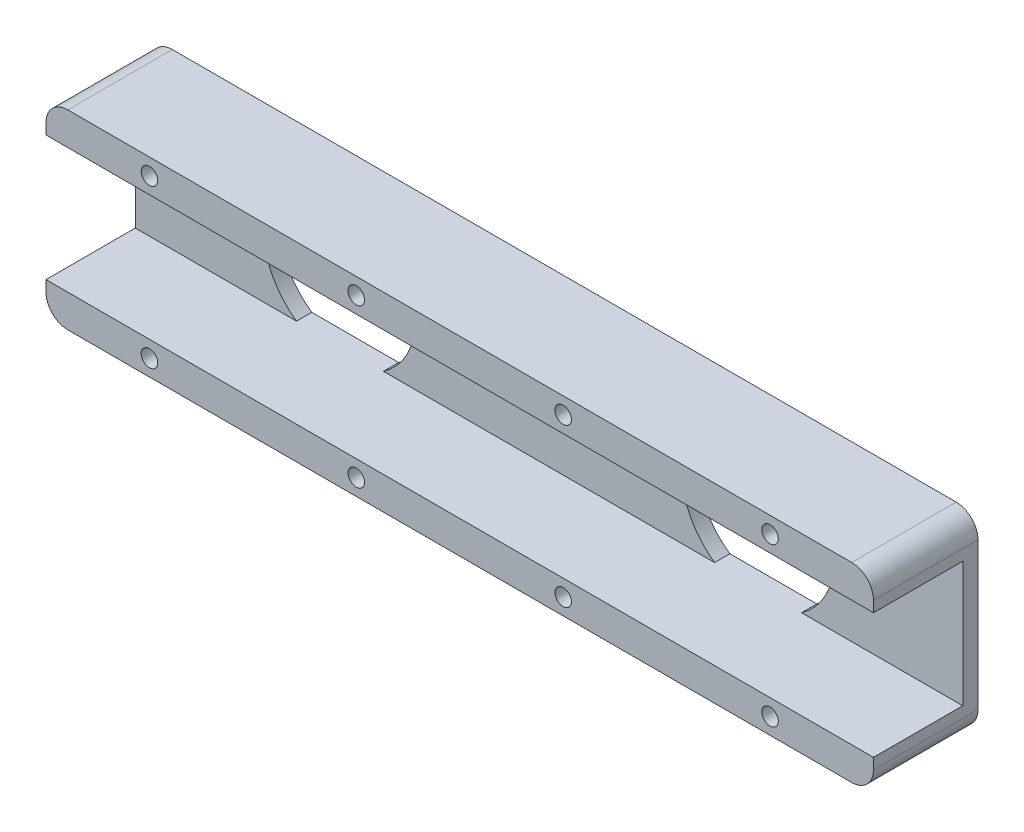
ISO-10303-21;
HEADER;
FILE_DESCRIPTION(('STEP AP214'),'2;1');
FILE_NAME('part.step','',(''),(''),'','','');
FILE_SCHEMA(('AUTOMOTIVE_DESIGN { 1 0 10303 214 1 1 1 1 }'));
ENDSEC;
DATA;
#1=APPLICATION_CONTEXT('core data for automotive mechanical design processes');
#2=APPLICATION_PROTOCOL_DEFINITION('international standard','automotive_design',2000,#1);
#3=PRODUCT_CONTEXT('',#1,'mechanical');
#4=PRODUCT('Part','Part','',(#3));
#5=PRODUCT_RELATED_PRODUCT_CATEGORY('part','',(#4));
#6=PRODUCT_DEFINITION_FORMATION('','',#4);
#7=PRODUCT_DEFINITION_CONTEXT('part definition',#1,'design');
#8=PRODUCT_DEFINITION('design','',#6,#7);
#9=PRODUCT_DEFINITION_SHAPE('','',#8);
#10=(LENGTH_UNIT() NAMED_UNIT(*) SI_UNIT(.MILLI.,.METRE.));
#11=(NAMED_UNIT(*) PLANE_ANGLE_UNIT() SI_UNIT($,.RADIAN.));
#12=(NAMED_UNIT(*) SI_UNIT($,.STERADIAN.) SOLID_ANGLE_UNIT());
#13=UNCERTAINTY_MEASURE_WITH_UNIT(LENGTH_MEASURE(1.E-05),#10,'distance_accuracy_value','');
#14=(GEOMETRIC_REPRESENTATION_CONTEXT(3) GLOBAL_UNCERTAINTY_ASSIGNED_CONTEXT((#13)) GLOBAL_UNIT_ASSIGNED_CONTEXT((#10,
#11,#12)) REPRESENTATION_CONTEXT('',''));
#15=CARTESIAN_POINT('',(0.,0.,0.));
#16=DIRECTION('',(0.,0.,1.));
#17=DIRECTION('',(1.,0.,0.));
#18=AXIS2_PLACEMENT_3D('',#15,#16,#17);
#19=CARTESIAN_POINT('',(0.,0.,3.5));
#20=DIRECTION('',(0.,0.,-1.));
#21=DIRECTION('',(-1.,0.,0.));
#22=AXIS2_PLACEMENT_3D('',#19,#20,#21);
#23=PLANE('',#22);
#24=DIRECTION('',(-1.,0.,0.));
#25=VECTOR('',#24,1.);
#26=CARTESIAN_POINT('',(95.,-14.375,3.5));
#27=LINE('',#26,#25);
#28=CARTESIAN_POINT('',(95.,-14.375,3.5));
#29=VERTEX_POINT('',#28);
#30=CARTESIAN_POINT('',(57.9804496391696,-14.375,3.5));
#31=VERTEX_POINT('',#30);
#32=EDGE_CURVE('E182',#29,#31,#27,.T.);
#33=ORIENTED_EDGE('',*,*,#32,.F.);
#34=DIRECTION('',(0.,1.,0.));
#35=VECTOR('',#34,1.);
#36=CARTESIAN_POINT('',(95.,-21.875,3.5));
#37=LINE('',#36,#35);
#38=CARTESIAN_POINT('',(95.,14.375,3.5));
#39=VERTEX_POINT('',#38);
#40=EDGE_CURVE('E196',#29,#39,#37,.T.);
#41=ORIENTED_EDGE('',*,*,#40,.T.);
#42=DIRECTION('',(1.,0.,0.));
#43=VECTOR('',#42,1.);
#44=CARTESIAN_POINT('',(95.,14.375,3.5));
#45=LINE('',#44,#43);
#46=CARTESIAN_POINT('',(57.9804496391696,14.375,3.5));
#47=VERTEX_POINT('',#46);
#48=EDGE_CURVE('E203',#47,#39,#45,.T.);
#49=ORIENTED_EDGE('',*,*,#48,.F.);
#50=CARTESIAN_POINT('',(48.,0.,3.5));
#51=DIRECTION('',(0.,0.,1.));
#52=DIRECTION('',(-1.,0.,0.));
#53=AXIS2_PLACEMENT_3D('',#50,#51,#52);
#54=CIRCLE('',#53,17.5);
#55=EDGE_CURVE('E254',#31,#47,#54,.T.);
#56=ORIENTED_EDGE('',*,*,#55,.F.);
#57=EDGE_LOOP('',(#33,#41,#49,#56));
#58=FACE_BOUND('',#57,.T.);
#59=ADVANCED_FACE('F33',(#58),#23,.F.);
#60=CARTESIAN_POINT('',(38.0195503608304,-14.375,3.5));
#61=VERTEX_POINT('',#60);
#62=CARTESIAN_POINT('',(-38.0195503608304,-14.375,3.5));
#63=VERTEX_POINT('',#62);
#64=EDGE_CURVE('E338',#61,#63,#27,.T.);
#65=ORIENTED_EDGE('',*,*,#64,.F.);
#66=CARTESIAN_POINT('',(48.,0.,3.5));
#67=DIRECTION('',(0.,0.,1.));
#68=DIRECTION('',(1.,0.,0.));
#69=AXIS2_PLACEMENT_3D('',#66,#67,#68);
#70=CIRCLE('',#69,17.5);
#71=CARTESIAN_POINT('',(38.0195503608304,14.375,3.5));
#72=VERTEX_POINT('',#71);
#73=EDGE_CURVE('E251',#72,#61,#70,.T.);
#74=ORIENTED_EDGE('',*,*,#73,.F.);
#75=CARTESIAN_POINT('',(-38.0195503608304,14.375,3.5));
#76=VERTEX_POINT('',#75);
#77=EDGE_CURVE('E202',#76,#72,#45,.T.);
#78=ORIENTED_EDGE('',*,*,#77,.F.);
#79=CARTESIAN_POINT('',(-48.,0.,3.5));
#80=DIRECTION('',(0.,0.,1.));
#81=DIRECTION('',(-1.,0.,0.));
#82=AXIS2_PLACEMENT_3D('',#79,#80,#81);
#83=CIRCLE('',#82,17.5);
#84=EDGE_CURVE('E226',#63,#76,#83,.T.);
#85=ORIENTED_EDGE('',*,*,#84,.F.);
#86=EDGE_LOOP('',(#65,#74,#78,#85));
#87=FACE_BOUND('',#86,.T.);
#88=ADVANCED_FACE('F456',(#87),#23,.F.);
#89=CARTESIAN_POINT('',(-57.9804496391696,-14.375,3.5));
#90=VERTEX_POINT('',#89);
#91=CARTESIAN_POINT('',(-95.,-14.375,3.5));
#92=VERTEX_POINT('',#91);
#93=EDGE_CURVE('E339',#90,#92,#27,.T.);
#94=ORIENTED_EDGE('',*,*,#93,.F.);
#95=CARTESIAN_POINT('',(-48.,0.,3.5));
#96=DIRECTION('',(0.,0.,1.));
#97=DIRECTION('',(1.,0.,0.));
#98=AXIS2_PLACEMENT_3D('',#95,#96,#97);
#99=CIRCLE('',#98,17.5);
#100=CARTESIAN_POINT('',(-57.9804496391696,14.375,3.5));
#101=VERTEX_POINT('',#100);
#102=EDGE_CURVE('E223',#101,#90,#99,.T.);
#103=ORIENTED_EDGE('',*,*,#102,.F.);
#104=CARTESIAN_POINT('',(-95.,14.375,3.5));
#105=VERTEX_POINT('',#104);
#106=EDGE_CURVE('E197',#105,#101,#45,.T.);
#107=ORIENTED_EDGE('',*,*,#106,.F.);
#108=DIRECTION('',(0.,-1.,0.));
#109=VECTOR('',#108,1.);
#110=CARTESIAN_POINT('',(-95.,14.375,3.5));
#111=LINE('',#110,#109);
#112=EDGE_CURVE('E279',#105,#92,#111,.T.);
#113=ORIENTED_EDGE('',*,*,#112,.T.);
#114=EDGE_LOOP('',(#94,#103,#107,#113));
#115=FACE_BOUND('',#114,.T.);
#116=ADVANCED_FACE('F423',(#115),#23,.F.);
#117=CARTESIAN_POINT('',(0.,0.,0.));
#118=DIRECTION('',(0.,0.,-1.));
#119=DIRECTION('',(-1.,0.,0.));
#120=AXIS2_PLACEMENT_3D('',#117,#118,#119);
#121=PLANE('',#120);
#122=CARTESIAN_POINT('',(-71.25,18.125,0.));
#123=DIRECTION('',(0.,0.,-1.));
#124=DIRECTION('',(-1.,0.,0.));
#125=AXIS2_PLACEMENT_3D('',#122,#123,#124);
#126=CIRCLE('',#125,3.5433);
#127=CARTESIAN_POINT('',(-74.7933,18.125,0.));
#128=VERTEX_POINT('',#127);
#129=EDGE_CURVE('E414',#128,#128,#126,.T.);
#130=ORIENTED_EDGE('',*,*,#129,.F.);
#131=EDGE_LOOP('',(#130));
#132=FACE_BOUND('',#131,.T.);
#133=CARTESIAN_POINT('',(-23.75,18.125,0.));
#134=DIRECTION('',(0.,0.,-1.));
#135=DIRECTION('',(-1.,0.,0.));
#136=AXIS2_PLACEMENT_3D('',#133,#134,#135);
#137=CIRCLE('',#136,3.5433);
#138=CARTESIAN_POINT('',(-27.2933,18.125,0.));
#139=VERTEX_POINT('',#138);
#140=EDGE_CURVE('E405',#139,#139,#137,.T.);
#141=ORIENTED_EDGE('',*,*,#140,.F.);
#142=EDGE_LOOP('',(#141));
#143=FACE_BOUND('',#142,.T.);
#144=CARTESIAN_POINT('',(23.75,18.125,0.));
#145=DIRECTION('',(0.,0.,-1.));
#146=DIRECTION('',(-1.,0.,0.));
#147=AXIS2_PLACEMENT_3D('',#144,#145,#146);
#148=CIRCLE('',#147,3.5433);
#149=CARTESIAN_POINT('',(20.2067,18.125,0.));
#150=VERTEX_POINT('',#149);
#151=EDGE_CURVE('E396',#150,#150,#148,.T.);
#152=ORIENTED_EDGE('',*,*,#151,.F.);
#153=EDGE_LOOP('',(#152));
#154=FACE_BOUND('',#153,.T.);
#155=CARTESIAN_POINT('',(71.25,18.125,0.));
#156=DIRECTION('',(0.,0.,-1.));
#157=DIRECTION('',(-1.,0.,0.));
#158=AXIS2_PLACEMENT_3D('',#155,#156,#157);
#159=CIRCLE('',#158,3.5433);
#160=CARTESIAN_POINT('',(67.7067,18.125,0.));
#161=VERTEX_POINT('',#160);
#162=EDGE_CURVE('E387',#161,#161,#159,.T.);
#163=ORIENTED_EDGE('',*,*,#162,.F.);
#164=EDGE_LOOP('',(#163));
#165=FACE_BOUND('',#164,.T.);
#166=CARTESIAN_POINT('',(-71.25,-18.125,0.));
#167=DIRECTION('',(0.,0.,-1.));
#168=DIRECTION('',(-1.,0.,0.));
#169=AXIS2_PLACEMENT_3D('',#166,#167,#168);
#170=CIRCLE('',#169,3.5433);
#171=CARTESIAN_POINT('',(-74.7933,-18.125,0.));
#172=VERTEX_POINT('',#171);
#173=EDGE_CURVE('E378',#172,#172,#170,.T.);
#174=ORIENTED_EDGE('',*,*,#173,.F.);
#175=EDGE_LOOP('',(#174));
#176=FACE_BOUND('',#175,.T.);
#177=CARTESIAN_POINT('',(-23.75,-18.125,0.));
#178=DIRECTION('',(0.,0.,-1.));
#179=DIRECTION('',(-1.,0.,0.));
#180=AXIS2_PLACEMENT_3D('',#177,#178,#179);
#181=CIRCLE('',#180,3.5433);
#182=CARTESIAN_POINT('',(-27.2933,-18.125,0.));
#183=VERTEX_POINT('',#182);
#184=EDGE_CURVE('E369',#183,#183,#181,.T.);
#185=ORIENTED_EDGE('',*,*,#184,.F.);
#186=EDGE_LOOP('',(#185));
#187=FACE_BOUND('',#186,.T.);
#188=CARTESIAN_POINT('',(23.75,-18.125,0.));
#189=DIRECTION('',(0.,0.,-1.));
#190=DIRECTION('',(-1.,0.,0.));
#191=AXIS2_PLACEMENT_3D('',#188,#189,#190);
#192=CIRCLE('',#191,3.5433);
#193=CARTESIAN_POINT('',(20.2067,-18.125,0.));
#194=VERTEX_POINT('',#193);
#195=EDGE_CURVE('E360',#194,#194,#192,.T.);
#196=ORIENTED_EDGE('',*,*,#195,.F.);
#197=EDGE_LOOP('',(#196));
#198=FACE_BOUND('',#197,.T.);
#199=CARTESIAN_POINT('',(71.25,-18.125,0.));
#200=DIRECTION('',(0.,0.,-1.));
#201=DIRECTION('',(-1.,0.,0.));
#202=AXIS2_PLACEMENT_3D('',#199,#200,#201);
#203=CIRCLE('',#202,3.5433);
#204=CARTESIAN_POINT('',(67.7067,-18.125,0.));
#205=VERTEX_POINT('',#204);
#206=EDGE_CURVE('E349',#205,#205,#203,.T.);
#207=ORIENTED_EDGE('',*,*,#206,.F.);
#208=EDGE_LOOP('',(#207));
#209=FACE_BOUND('',#208,.T.);
#210=DIRECTION('',(-1.,0.,0.));
#211=VECTOR('',#210,1.);
#212=CARTESIAN_POINT('',(-95.,21.875,0.));
#213=LINE('',#212,#211);
#214=CARTESIAN_POINT('',(90.,21.875,0.));
#215=VERTEX_POINT('',#214);
#216=CARTESIAN_POINT('',(-90.,21.875,0.));
#217=VERTEX_POINT('',#216);
#218=EDGE_CURVE('E278',#215,#217,#213,.T.);
#219=ORIENTED_EDGE('',*,*,#218,.F.);
#220=CARTESIAN_POINT('',(90.,16.875,0.));
#221=DIRECTION('',(0.,0.,-1.));
#222=DIRECTION('',(-1.,0.,0.));
#223=AXIS2_PLACEMENT_3D('',#220,#221,#222);
#224=CIRCLE('',#223,5.);
#225=CARTESIAN_POINT('',(95.,16.875,0.));
#226=VERTEX_POINT('',#225);
#227=EDGE_CURVE('E302',#215,#226,#224,.T.);
#228=ORIENTED_EDGE('',*,*,#227,.T.);
#229=DIRECTION('',(0.,1.,0.));
#230=VECTOR('',#229,1.);
#231=CARTESIAN_POINT('',(95.,21.875,0.));
#232=LINE('',#231,#230);
#233=CARTESIAN_POINT('',(95.,-16.875,0.));
#234=VERTEX_POINT('',#233);
#235=EDGE_CURVE('E282',#234,#226,#232,.T.);
#236=ORIENTED_EDGE('',*,*,#235,.F.);
#237=CARTESIAN_POINT('',(90.,-16.875,0.));
#238=DIRECTION('',(0.,0.,-1.));
#239=DIRECTION('',(-1.,0.,0.));
#240=AXIS2_PLACEMENT_3D('',#237,#238,#239);
#241=CIRCLE('',#240,5.);
#242=CARTESIAN_POINT('',(90.,-21.875,0.));
#243=VERTEX_POINT('',#242);
#244=EDGE_CURVE('E300',#234,#243,#241,.T.);
#245=ORIENTED_EDGE('',*,*,#244,.T.);
#246=DIRECTION('',(1.,0.,0.));
#247=VECTOR('',#246,1.);
#248=CARTESIAN_POINT('',(-95.,-21.875,0.));
#249=LINE('',#248,#247);
#250=CARTESIAN_POINT('',(-90.,-21.875,0.));
#251=VERTEX_POINT('',#250);
#252=EDGE_CURVE('E288',#251,#243,#249,.T.);
#253=ORIENTED_EDGE('',*,*,#252,.F.);
#254=CARTESIAN_POINT('',(-90.,-16.875,0.));
#255=DIRECTION('',(0.,0.,-1.));
#256=DIRECTION('',(-1.,0.,0.));
#257=AXIS2_PLACEMENT_3D('',#254,#255,#256);
#258=CIRCLE('',#257,5.);
#259=CARTESIAN_POINT('',(-95.,-16.875,0.));
#260=VERTEX_POINT('',#259);
#261=EDGE_CURVE('E298',#251,#260,#258,.T.);
#262=ORIENTED_EDGE('',*,*,#261,.T.);
#263=DIRECTION('',(0.,-1.,0.));
#264=VECTOR('',#263,1.);
#265=CARTESIAN_POINT('',(-95.,-14.375,0.));
#266=LINE('',#265,#264);
#267=CARTESIAN_POINT('',(-95.,16.875,0.));
#268=VERTEX_POINT('',#267);
#269=EDGE_CURVE('E286',#268,#260,#266,.T.);
#270=ORIENTED_EDGE('',*,*,#269,.F.);
#271=CARTESIAN_POINT('',(-90.,16.875,0.));
#272=DIRECTION('',(0.,0.,-1.));
#273=DIRECTION('',(-1.,0.,0.));
#274=AXIS2_PLACEMENT_3D('',#271,#272,#273);
#275=CIRCLE('',#274,5.);
#276=EDGE_CURVE('E296',#268,#217,#275,.T.);
#277=ORIENTED_EDGE('',*,*,#276,.T.);
#278=EDGE_LOOP('',(#219,#228,#236,#245,#253,#262,#270,#277));
#279=FACE_BOUND('',#278,.T.);
#280=DIRECTION('',(-1.,0.,0.));
#281=VECTOR('',#280,1.);
#282=CARTESIAN_POINT('',(57.9804496391696,14.375,0.));
#283=LINE('',#282,#281);
#284=CARTESIAN_POINT('',(57.9804496391696,14.375,0.));
#285=VERTEX_POINT('',#284);
#286=CARTESIAN_POINT('',(38.0195503608304,14.375,0.));
#287=VERTEX_POINT('',#286);
#288=EDGE_CURVE('E255',#285,#287,#283,.T.);
#289=ORIENTED_EDGE('',*,*,#288,.T.);
#290=CARTESIAN_POINT('',(48.,0.,0.));
#291=DIRECTION('',(0.,0.,1.));
#292=DIRECTION('',(1.,0.,0.));
#293=AXIS2_PLACEMENT_3D('',#290,#291,#292);
#294=CIRCLE('',#293,17.5);
#295=CARTESIAN_POINT('',(38.0195503608304,-14.375,0.));
#296=VERTEX_POINT('',#295);
#297=EDGE_CURVE('E250',#287,#296,#294,.T.);
#298=ORIENTED_EDGE('',*,*,#297,.T.);
#299=DIRECTION('',(1.,0.,0.));
#300=VECTOR('',#299,1.);
#301=CARTESIAN_POINT('',(57.9804496391696,-14.375,0.));
#302=LINE('',#301,#300);
#303=CARTESIAN_POINT('',(57.9804496391696,-14.375,0.));
#304=VERTEX_POINT('',#303);
#305=EDGE_CURVE('E261',#296,#304,#302,.T.);
#306=ORIENTED_EDGE('',*,*,#305,.T.);
#307=CARTESIAN_POINT('',(48.,0.,0.));
#308=DIRECTION('',(0.,0.,1.));
#309=DIRECTION('',(-1.,0.,0.));
#310=AXIS2_PLACEMENT_3D('',#307,#308,#309);
#311=CIRCLE('',#310,17.5);
#312=EDGE_CURVE('E264',#304,#285,#311,.T.);
#313=ORIENTED_EDGE('',*,*,#312,.T.);
#314=EDGE_LOOP('',(#289,#298,#306,#313));
#315=FACE_BOUND('',#314,.T.);
#316=DIRECTION('',(-1.,0.,0.));
#317=VECTOR('',#316,1.);
#318=CARTESIAN_POINT('',(-57.9804496391696,14.375,0.));
#319=LINE('',#318,#317);
#320=CARTESIAN_POINT('',(-38.0195503608304,14.375,0.));
#321=VERTEX_POINT('',#320);
#322=CARTESIAN_POINT('',(-57.9804496391696,14.375,0.));
#323=VERTEX_POINT('',#322);
#324=EDGE_CURVE('E227',#321,#323,#319,.T.);
#325=ORIENTED_EDGE('',*,*,#324,.T.);
#326=CARTESIAN_POINT('',(-48.,0.,0.));
#327=DIRECTION('',(0.,0.,1.));
#328=DIRECTION('',(1.,0.,0.));
#329=AXIS2_PLACEMENT_3D('',#326,#327,#328);
#330=CIRCLE('',#329,17.5);
#331=CARTESIAN_POINT('',(-57.9804496391696,-14.375,0.));
#332=VERTEX_POINT('',#331);
#333=EDGE_CURVE('E222',#323,#332,#330,.T.);
#334=ORIENTED_EDGE('',*,*,#333,.T.);
#335=DIRECTION('',(1.,0.,0.));
#336=VECTOR('',#335,1.);
#337=CARTESIAN_POINT('',(-57.9804496391696,-14.375,0.));
#338=LINE('',#337,#336);
#339=CARTESIAN_POINT('',(-38.0195503608304,-14.375,0.));
#340=VERTEX_POINT('',#339);
#341=EDGE_CURVE('E233',#332,#340,#338,.T.);
#342=ORIENTED_EDGE('',*,*,#341,.T.);
#343=CARTESIAN_POINT('',(-48.,0.,0.));
#344=DIRECTION('',(0.,0.,1.));
#345=DIRECTION('',(-1.,0.,0.));
#346=AXIS2_PLACEMENT_3D('',#343,#344,#345);
#347=CIRCLE('',#346,17.5);
#348=EDGE_CURVE('E236',#340,#321,#347,.T.);
#349=ORIENTED_EDGE('',*,*,#348,.T.);
#350=EDGE_LOOP('',(#325,#334,#342,#349));
#351=FACE_BOUND('',#350,.T.);
#352=ADVANCED_FACE('F328',(#132,#143,#154,#165,#176,#187,#198,#209,#279,#315,#351),#121,.T.);
#353=CARTESIAN_POINT('',(-95.,21.875,3.5));
#354=DIRECTION('',(0.,-1.,0.));
#355=DIRECTION('',(1.,0.,0.));
#356=AXIS2_PLACEMENT_3D('',#353,#354,#355);
#357=PLANE('',#356);
#358=DIRECTION('',(-1.,0.,0.));
#359=VECTOR('',#358,1.);
#360=CARTESIAN_POINT('',(95.,21.875,24.));
#361=LINE('',#360,#359);
#362=CARTESIAN_POINT('',(90.,21.875,24.));
#363=VERTEX_POINT('',#362);
#364=CARTESIAN_POINT('',(-90.,21.875,24.));
#365=VERTEX_POINT('',#364);
#366=EDGE_CURVE('E210',#363,#365,#361,.T.);
#367=ORIENTED_EDGE('',*,*,#366,.F.);
#368=DIRECTION('',(0.,0.,-1.));
#369=VECTOR('',#368,1.);
#370=CARTESIAN_POINT('',(90.,21.875,3.5));
#371=LINE('',#370,#369);
#372=EDGE_CURVE('E293',#363,#215,#371,.T.);
#373=ORIENTED_EDGE('',*,*,#372,.T.);
#374=ORIENTED_EDGE('',*,*,#218,.T.);
#375=DIRECTION('',(0.,0.,-1.));
#376=VECTOR('',#375,1.);
#377=CARTESIAN_POINT('',(-90.,21.875,3.5));
#378=LINE('',#377,#376);
#379=EDGE_CURVE('E291',#217,#365,#378,.F.);
#380=ORIENTED_EDGE('',*,*,#379,.T.);
#381=EDGE_LOOP('',(#367,#373,#374,#380));
#382=FACE_BOUND('',#381,.T.);
#383=ADVANCED_FACE('F422',(#382),#357,.F.);
#384=CARTESIAN_POINT('',(-95.,-14.375,3.5));
#385=DIRECTION('',(1.,0.,0.));
#386=DIRECTION('',(0.,0.,-1.));
#387=AXIS2_PLACEMENT_3D('',#384,#385,#386);
#388=PLANE('',#387);
#389=ORIENTED_EDGE('',*,*,#269,.T.);
#390=DIRECTION('',(0.,0.,-1.));
#391=VECTOR('',#390,1.);
#392=CARTESIAN_POINT('',(-95.,-16.875,3.5));
#393=LINE('',#392,#391);
#394=CARTESIAN_POINT('',(-95.,-16.875,24.));
#395=VERTEX_POINT('',#394);
#396=EDGE_CURVE('E11',#260,#395,#393,.F.);
#397=ORIENTED_EDGE('',*,*,#396,.T.);
#398=DIRECTION('',(0.,-1.,0.));
#399=VECTOR('',#398,1.);
#400=CARTESIAN_POINT('',(-95.,-14.375,24.));
#401=LINE('',#400,#399);
#402=CARTESIAN_POINT('',(-95.,-14.375,24.));
#403=VERTEX_POINT('',#402);
#404=EDGE_CURVE('E190',#403,#395,#401,.T.);
#405=ORIENTED_EDGE('',*,*,#404,.F.);
#406=DIRECTION('',(0.,0.,-1.));
#407=VECTOR('',#406,1.);
#408=CARTESIAN_POINT('',(-95.,-14.375,24.));
#409=LINE('',#408,#407);
#410=EDGE_CURVE('E189',#403,#92,#409,.T.);
#411=ORIENTED_EDGE('',*,*,#410,.T.);
#412=ORIENTED_EDGE('',*,*,#112,.F.);
#413=DIRECTION('',(0.,0.,-1.));
#414=VECTOR('',#413,1.);
#415=CARTESIAN_POINT('',(-95.,14.375,24.));
#416=LINE('',#415,#414);
#417=CARTESIAN_POINT('',(-95.,14.375,24.));
#418=VERTEX_POINT('',#417);
#419=EDGE_CURVE('E219',#418,#105,#416,.T.);
#420=ORIENTED_EDGE('',*,*,#419,.F.);
#421=DIRECTION('',(0.,-1.,0.));
#422=VECTOR('',#421,1.);
#423=CARTESIAN_POINT('',(-95.,21.875,24.));
#424=LINE('',#423,#422);
#425=CARTESIAN_POINT('',(-95.,16.875,24.));
#426=VERTEX_POINT('',#425);
#427=EDGE_CURVE('E213',#426,#418,#424,.T.);
#428=ORIENTED_EDGE('',*,*,#427,.F.);
#429=DIRECTION('',(0.,0.,-1.));
#430=VECTOR('',#429,1.);
#431=CARTESIAN_POINT('',(-95.,16.875,3.5));
#432=LINE('',#431,#430);
#433=EDGE_CURVE('E41',#426,#268,#432,.T.);
#434=ORIENTED_EDGE('',*,*,#433,.T.);
#435=EDGE_LOOP('',(#389,#397,#405,#411,#412,#420,#428,#434));
#436=FACE_BOUND('',#435,.T.);
#437=ADVANCED_FACE('F322',(#436),#388,.F.);
#438=CARTESIAN_POINT('',(-95.,-21.875,3.5));
#439=DIRECTION('',(0.,1.,0.));
#440=DIRECTION('',(-1.,0.,0.));
#441=AXIS2_PLACEMENT_3D('',#438,#439,#440);
#442=PLANE('',#441);
#443=ORIENTED_EDGE('',*,*,#252,.T.);
#444=DIRECTION('',(0.,0.,-1.));
#445=VECTOR('',#444,1.);
#446=CARTESIAN_POINT('',(90.,-21.875,3.5));
#447=LINE('',#446,#445);
#448=CARTESIAN_POINT('',(90.,-21.875,24.));
#449=VERTEX_POINT('',#448);
#450=EDGE_CURVE('E54',#243,#449,#447,.F.);
#451=ORIENTED_EDGE('',*,*,#450,.T.);
#452=DIRECTION('',(1.,0.,0.));
#453=VECTOR('',#452,1.);
#454=CARTESIAN_POINT('',(95.,-21.875,24.));
#455=LINE('',#454,#453);
#456=CARTESIAN_POINT('',(-90.,-21.875,24.));
#457=VERTEX_POINT('',#456);
#458=EDGE_CURVE('E204',#457,#449,#455,.T.);
#459=ORIENTED_EDGE('',*,*,#458,.F.);
#460=DIRECTION('',(0.,0.,-1.));
#461=VECTOR('',#460,1.);
#462=CARTESIAN_POINT('',(-90.,-21.875,3.5));
#463=LINE('',#462,#461);
#464=EDGE_CURVE('E312',#457,#251,#463,.T.);
#465=ORIENTED_EDGE('',*,*,#464,.T.);
#466=EDGE_LOOP('',(#443,#451,#459,#465));
#467=FACE_BOUND('',#466,.T.);
#468=ADVANCED_FACE('F335',(#467),#442,.F.);
#469=CARTESIAN_POINT('',(95.,21.875,3.5));
#470=DIRECTION('',(-1.,0.,0.));
#471=DIRECTION('',(0.,0.,1.));
#472=AXIS2_PLACEMENT_3D('',#469,#470,#471);
#473=PLANE('',#472);
#474=ORIENTED_EDGE('',*,*,#235,.T.);
#475=DIRECTION('',(0.,0.,-1.));
#476=VECTOR('',#475,1.);
#477=CARTESIAN_POINT('',(95.,16.875,3.5));
#478=LINE('',#477,#476);
#479=CARTESIAN_POINT('',(95.,16.875,24.));
#480=VERTEX_POINT('',#479);
#481=EDGE_CURVE('E306',#226,#480,#478,.F.);
#482=ORIENTED_EDGE('',*,*,#481,.T.);
#483=DIRECTION('',(0.,1.,0.));
#484=VECTOR('',#483,1.);
#485=CARTESIAN_POINT('',(95.,21.875,24.));
#486=LINE('',#485,#484);
#487=CARTESIAN_POINT('',(95.,14.375,24.));
#488=VERTEX_POINT('',#487);
#489=EDGE_CURVE('E200',#488,#480,#486,.T.);
#490=ORIENTED_EDGE('',*,*,#489,.F.);
#491=DIRECTION('',(0.,0.,-1.));
#492=VECTOR('',#491,1.);
#493=CARTESIAN_POINT('',(95.,14.375,24.));
#494=LINE('',#493,#492);
#495=EDGE_CURVE('E216',#488,#39,#494,.T.);
#496=ORIENTED_EDGE('',*,*,#495,.T.);
#497=ORIENTED_EDGE('',*,*,#40,.F.);
#498=DIRECTION('',(0.,0.,-1.));
#499=VECTOR('',#498,1.);
#500=CARTESIAN_POINT('',(95.,-14.375,24.));
#501=LINE('',#500,#499);
#502=CARTESIAN_POINT('',(95.,-14.375,24.));
#503=VERTEX_POINT('',#502);
#504=EDGE_CURVE('E186',#503,#29,#501,.T.);
#505=ORIENTED_EDGE('',*,*,#504,.F.);
#506=DIRECTION('',(0.,1.,0.));
#507=VECTOR('',#506,1.);
#508=CARTESIAN_POINT('',(95.,-14.375,24.));
#509=LINE('',#508,#507);
#510=CARTESIAN_POINT('',(95.,-16.875,24.));
#511=VERTEX_POINT('',#510);
#512=EDGE_CURVE('E171',#511,#503,#509,.T.);
#513=ORIENTED_EDGE('',*,*,#512,.F.);
#514=DIRECTION('',(0.,0.,-1.));
#515=VECTOR('',#514,1.);
#516=CARTESIAN_POINT('',(95.,-16.875,3.5));
#517=LINE('',#516,#515);
#518=EDGE_CURVE('E304',#511,#234,#517,.T.);
#519=ORIENTED_EDGE('',*,*,#518,.T.);
#520=EDGE_LOOP('',(#474,#482,#490,#496,#497,#505,#513,#519));
#521=FACE_BOUND('',#520,.T.);
#522=ADVANCED_FACE('F194',(#521),#473,.F.);
#523=CARTESIAN_POINT('',(48.,0.,3.5));
#524=DIRECTION('',(0.,0.,-1.));
#525=DIRECTION('',(-1.,0.,0.));
#526=AXIS2_PLACEMENT_3D('',#523,#524,#525);
#527=CYLINDRICAL_SURFACE('',#526,17.5);
#528=ORIENTED_EDGE('',*,*,#297,.F.);
#529=DIRECTION('',(0.,0.,-1.));
#530=VECTOR('',#529,1.);
#531=CARTESIAN_POINT('',(38.0195503608304,14.375,3.5));
#532=LINE('',#531,#530);
#533=EDGE_CURVE('E258',#72,#287,#532,.T.);
#534=ORIENTED_EDGE('',*,*,#533,.F.);
#535=ORIENTED_EDGE('',*,*,#73,.T.);
#536=DIRECTION('',(0.,0.,-1.));
#537=VECTOR('',#536,1.);
#538=CARTESIAN_POINT('',(38.0195503608304,-14.375,3.5));
#539=LINE('',#538,#537);
#540=EDGE_CURVE('E275',#61,#296,#539,.T.);
#541=ORIENTED_EDGE('',*,*,#540,.T.);
#542=EDGE_LOOP('',(#528,#534,#535,#541));
#543=FACE_BOUND('',#542,.T.);
#544=ADVANCED_FACE('F561',(#543),#527,.F.);
#545=CARTESIAN_POINT('',(57.9804496391696,-14.375,3.5));
#546=DIRECTION('',(0.,1.,0.));
#547=DIRECTION('',(-1.,0.,0.));
#548=AXIS2_PLACEMENT_3D('',#545,#546,#547);
#549=PLANE('',#548);
#550=ORIENTED_EDGE('',*,*,#305,.F.);
#551=ORIENTED_EDGE('',*,*,#540,.F.);
#552=ORIENTED_EDGE('',*,*,#64,.T.);
#553=DIRECTION('',(0.,0.,-1.));
#554=VECTOR('',#553,1.);
#555=CARTESIAN_POINT('',(-38.0195503608304,-14.375,3.5));
#556=LINE('',#555,#554);
#557=EDGE_CURVE('E245',#63,#340,#556,.T.);
#558=ORIENTED_EDGE('',*,*,#557,.T.);
#559=ORIENTED_EDGE('',*,*,#341,.F.);
#560=DIRECTION('',(0.,0.,-1.));
#561=VECTOR('',#560,1.);
#562=CARTESIAN_POINT('',(-57.9804496391696,-14.375,3.5));
#563=LINE('',#562,#561);
#564=EDGE_CURVE('E247',#90,#332,#563,.T.);
#565=ORIENTED_EDGE('',*,*,#564,.F.);
#566=ORIENTED_EDGE('',*,*,#93,.T.);
#567=ORIENTED_EDGE('',*,*,#410,.F.);
#568=DIRECTION('',(-1.,0.,0.));
#569=VECTOR('',#568,1.);
#570=CARTESIAN_POINT('',(95.,-14.375,24.));
#571=LINE('',#570,#569);
#572=EDGE_CURVE('E174',#503,#403,#571,.T.);
#573=ORIENTED_EDGE('',*,*,#572,.F.);
#574=ORIENTED_EDGE('',*,*,#504,.T.);
#575=ORIENTED_EDGE('',*,*,#32,.T.);
#576=DIRECTION('',(0.,0.,-1.));
#577=VECTOR('',#576,1.);
#578=CARTESIAN_POINT('',(57.9804496391696,-14.375,3.5));
#579=LINE('',#578,#577);
#580=EDGE_CURVE('E273',#31,#304,#579,.T.);
#581=ORIENTED_EDGE('',*,*,#580,.T.);
#582=EDGE_LOOP('',(#550,#551,#552,#558,#559,#565,#566,#567,#573,#574,#575,#581));
#583=FACE_BOUND('',#582,.T.);
#584=ADVANCED_FACE('F185',(#583),#549,.T.);
#585=CARTESIAN_POINT('',(48.,0.,3.5));
#586=DIRECTION('',(0.,0.,-1.));
#587=DIRECTION('',(-1.,0.,0.));
#588=AXIS2_PLACEMENT_3D('',#585,#586,#587);
#589=CYLINDRICAL_SURFACE('',#588,17.5);
#590=ORIENTED_EDGE('',*,*,#312,.F.);
#591=ORIENTED_EDGE('',*,*,#580,.F.);
#592=ORIENTED_EDGE('',*,*,#55,.T.);
#593=DIRECTION('',(0.,0.,-1.));
#594=VECTOR('',#593,1.);
#595=CARTESIAN_POINT('',(57.9804496391696,14.375,3.5));
#596=LINE('',#595,#594);
#597=EDGE_CURVE('E271',#47,#285,#596,.T.);
#598=ORIENTED_EDGE('',*,*,#597,.T.);
#599=EDGE_LOOP('',(#590,#591,#592,#598));
#600=FACE_BOUND('',#599,.T.);
#601=ADVANCED_FACE('F760',(#600),#589,.F.);
#602=CARTESIAN_POINT('',(57.9804496391696,14.375,3.5));
#603=DIRECTION('',(0.,-1.,0.));
#604=DIRECTION('',(1.,0.,0.));
#605=AXIS2_PLACEMENT_3D('',#602,#603,#604);
#606=PLANE('',#605);
#607=ORIENTED_EDGE('',*,*,#288,.F.);
#608=ORIENTED_EDGE('',*,*,#597,.F.);
#609=ORIENTED_EDGE('',*,*,#48,.T.);
#610=ORIENTED_EDGE('',*,*,#495,.F.);
#611=DIRECTION('',(1.,0.,0.));
#612=VECTOR('',#611,1.);
#613=CARTESIAN_POINT('',(95.,14.375,24.));
#614=LINE('',#613,#612);
#615=EDGE_CURVE('E215',#418,#488,#614,.T.);
#616=ORIENTED_EDGE('',*,*,#615,.F.);
#617=ORIENTED_EDGE('',*,*,#419,.T.);
#618=ORIENTED_EDGE('',*,*,#106,.T.);
#619=DIRECTION('',(0.,0.,-1.));
#620=VECTOR('',#619,1.);
#621=CARTESIAN_POINT('',(-57.9804496391696,14.375,3.5));
#622=LINE('',#621,#620);
#623=EDGE_CURVE('E230',#101,#323,#622,.T.);
#624=ORIENTED_EDGE('',*,*,#623,.T.);
#625=ORIENTED_EDGE('',*,*,#324,.F.);
#626=DIRECTION('',(0.,0.,-1.));
#627=VECTOR('',#626,1.);
#628=CARTESIAN_POINT('',(-38.0195503608304,14.375,3.5));
#629=LINE('',#628,#627);
#630=EDGE_CURVE('E243',#76,#321,#629,.T.);
#631=ORIENTED_EDGE('',*,*,#630,.F.);
#632=ORIENTED_EDGE('',*,*,#77,.T.);
#633=ORIENTED_EDGE('',*,*,#533,.T.);
#634=EDGE_LOOP('',(#607,#608,#609,#610,#616,#617,#618,#624,#625,#631,#632,#633));
#635=FACE_BOUND('',#634,.T.);
#636=ADVANCED_FACE('F478',(#635),#606,.T.);
#637=CARTESIAN_POINT('',(-48.,0.,3.5));
#638=DIRECTION('',(0.,0.,-1.));
#639=DIRECTION('',(-1.,0.,0.));
#640=AXIS2_PLACEMENT_3D('',#637,#638,#639);
#641=CYLINDRICAL_SURFACE('',#640,17.5);
#642=ORIENTED_EDGE('',*,*,#333,.F.);
#643=ORIENTED_EDGE('',*,*,#623,.F.);
#644=ORIENTED_EDGE('',*,*,#102,.T.);
#645=ORIENTED_EDGE('',*,*,#564,.T.);
#646=EDGE_LOOP('',(#642,#643,#644,#645));
#647=FACE_BOUND('',#646,.T.);
#648=ADVANCED_FACE('F471',(#647),#641,.F.);
#649=CARTESIAN_POINT('',(-48.,0.,3.5));
#650=DIRECTION('',(0.,0.,-1.));
#651=DIRECTION('',(-1.,0.,0.));
#652=AXIS2_PLACEMENT_3D('',#649,#650,#651);
#653=CYLINDRICAL_SURFACE('',#652,17.5);
#654=ORIENTED_EDGE('',*,*,#348,.F.);
#655=ORIENTED_EDGE('',*,*,#557,.F.);
#656=ORIENTED_EDGE('',*,*,#84,.T.);
#657=ORIENTED_EDGE('',*,*,#630,.T.);
#658=EDGE_LOOP('',(#654,#655,#656,#657));
#659=FACE_BOUND('',#658,.T.);
#660=ADVANCED_FACE('F549',(#659),#653,.F.);
#661=CARTESIAN_POINT('',(0.,0.,24.));
#662=DIRECTION('',(0.,0.,-1.));
#663=DIRECTION('',(-1.,0.,0.));
#664=AXIS2_PLACEMENT_3D('',#661,#662,#663);
#665=PLANE('',#664);
#666=CARTESIAN_POINT('',(-71.25,18.125,24.));
#667=DIRECTION('',(0.,0.,-1.));
#668=DIRECTION('',(-1.,0.,0.));
#669=AXIS2_PLACEMENT_3D('',#666,#667,#668);
#670=CIRCLE('',#669,1.89864999999999);
#671=CARTESIAN_POINT('',(-73.14865,18.125,24.));
#672=VERTEX_POINT('',#671);
#673=EDGE_CURVE('E408',#672,#672,#670,.T.);
#674=ORIENTED_EDGE('',*,*,#673,.T.);
#675=EDGE_LOOP('',(#674));
#676=FACE_BOUND('',#675,.T.);
#677=CARTESIAN_POINT('',(-23.75,18.125,24.));
#678=DIRECTION('',(0.,0.,-1.));
#679=DIRECTION('',(-1.,0.,0.));
#680=AXIS2_PLACEMENT_3D('',#677,#678,#679);
#681=CIRCLE('',#680,1.89864999999999);
#682=CARTESIAN_POINT('',(-25.64865,18.125,24.));
#683=VERTEX_POINT('',#682);
#684=EDGE_CURVE('E399',#683,#683,#681,.T.);
#685=ORIENTED_EDGE('',*,*,#684,.T.);
#686=EDGE_LOOP('',(#685));
#687=FACE_BOUND('',#686,.T.);
#688=CARTESIAN_POINT('',(23.75,18.125,24.));
#689=DIRECTION('',(0.,0.,-1.));
#690=DIRECTION('',(-1.,0.,0.));
#691=AXIS2_PLACEMENT_3D('',#688,#689,#690);
#692=CIRCLE('',#691,1.89864999999999);
#693=CARTESIAN_POINT('',(21.85135,18.125,24.));
#694=VERTEX_POINT('',#693);
#695=EDGE_CURVE('E390',#694,#694,#692,.T.);
#696=ORIENTED_EDGE('',*,*,#695,.T.);
#697=EDGE_LOOP('',(#696));
#698=FACE_BOUND('',#697,.T.);
#699=CARTESIAN_POINT('',(71.25,18.125,24.));
#700=DIRECTION('',(0.,0.,-1.));
#701=DIRECTION('',(-1.,0.,0.));
#702=AXIS2_PLACEMENT_3D('',#699,#700,#701);
#703=CIRCLE('',#702,1.89864999999999);
#704=CARTESIAN_POINT('',(69.35135,18.125,24.));
#705=VERTEX_POINT('',#704);
#706=EDGE_CURVE('E381',#705,#705,#703,.T.);
#707=ORIENTED_EDGE('',*,*,#706,.T.);
#708=EDGE_LOOP('',(#707));
#709=FACE_BOUND('',#708,.T.);
#710=ORIENTED_EDGE('',*,*,#489,.T.);
#711=CARTESIAN_POINT('',(90.,16.875,24.));
#712=DIRECTION('',(0.,0.,-1.));
#713=DIRECTION('',(-1.,0.,0.));
#714=AXIS2_PLACEMENT_3D('',#711,#712,#713);
#715=CIRCLE('',#714,5.);
#716=EDGE_CURVE('E310',#480,#363,#715,.F.);
#717=ORIENTED_EDGE('',*,*,#716,.T.);
#718=ORIENTED_EDGE('',*,*,#366,.T.);
#719=CARTESIAN_POINT('',(-90.,16.875,24.));
#720=DIRECTION('',(0.,0.,-1.));
#721=DIRECTION('',(-1.,0.,0.));
#722=AXIS2_PLACEMENT_3D('',#719,#720,#721);
#723=CIRCLE('',#722,5.);
#724=EDGE_CURVE('E308',#365,#426,#723,.F.);
#725=ORIENTED_EDGE('',*,*,#724,.T.);
#726=ORIENTED_EDGE('',*,*,#427,.T.);
#727=ORIENTED_EDGE('',*,*,#615,.T.);
#728=EDGE_LOOP('',(#710,#717,#718,#725,#726,#727));
#729=FACE_BOUND('',#728,.T.);
#730=ADVANCED_FACE('F485',(#676,#687,#698,#709,#729),#665,.F.);
#731=CARTESIAN_POINT('',(0.,0.,24.));
#732=DIRECTION('',(0.,0.,-1.));
#733=DIRECTION('',(-1.,0.,0.));
#734=AXIS2_PLACEMENT_3D('',#731,#732,#733);
#735=PLANE('',#734);
#736=CARTESIAN_POINT('',(-71.25,-18.125,24.));
#737=DIRECTION('',(0.,0.,-1.));
#738=DIRECTION('',(-1.,0.,0.));
#739=AXIS2_PLACEMENT_3D('',#736,#737,#738);
#740=CIRCLE('',#739,1.89864999999999);
#741=CARTESIAN_POINT('',(-73.14865,-18.125,24.));
#742=VERTEX_POINT('',#741);
#743=EDGE_CURVE('E372',#742,#742,#740,.T.);
#744=ORIENTED_EDGE('',*,*,#743,.T.);
#745=EDGE_LOOP('',(#744));
#746=FACE_BOUND('',#745,.T.);
#747=CARTESIAN_POINT('',(-23.75,-18.125,24.));
#748=DIRECTION('',(0.,0.,-1.));
#749=DIRECTION('',(-1.,0.,0.));
#750=AXIS2_PLACEMENT_3D('',#747,#748,#749);
#751=CIRCLE('',#750,1.89864999999999);
#752=CARTESIAN_POINT('',(-25.64865,-18.125,24.));
#753=VERTEX_POINT('',#752);
#754=EDGE_CURVE('E363',#753,#753,#751,.T.);
#755=ORIENTED_EDGE('',*,*,#754,.T.);
#756=EDGE_LOOP('',(#755));
#757=FACE_BOUND('',#756,.T.);
#758=CARTESIAN_POINT('',(23.75,-18.125,24.));
#759=DIRECTION('',(0.,0.,-1.));
#760=DIRECTION('',(-1.,0.,0.));
#761=AXIS2_PLACEMENT_3D('',#758,#759,#760);
#762=CIRCLE('',#761,1.89864999999999);
#763=CARTESIAN_POINT('',(21.85135,-18.125,24.));
#764=VERTEX_POINT('',#763);
#765=EDGE_CURVE('E354',#764,#764,#762,.T.);
#766=ORIENTED_EDGE('',*,*,#765,.T.);
#767=EDGE_LOOP('',(#766));
#768=FACE_BOUND('',#767,.T.);
#769=CARTESIAN_POINT('',(71.25,-18.125,24.));
#770=DIRECTION('',(0.,0.,-1.));
#771=DIRECTION('',(-1.,0.,0.));
#772=AXIS2_PLACEMENT_3D('',#769,#770,#771);
#773=CIRCLE('',#772,1.89864999999999);
#774=CARTESIAN_POINT('',(69.35135,-18.125,24.));
#775=VERTEX_POINT('',#774);
#776=EDGE_CURVE('E341',#775,#775,#773,.T.);
#777=ORIENTED_EDGE('',*,*,#776,.T.);
#778=EDGE_LOOP('',(#777));
#779=FACE_BOUND('',#778,.T.);
#780=ORIENTED_EDGE('',*,*,#458,.T.);
#781=CARTESIAN_POINT('',(90.,-16.875,24.));
#782=DIRECTION('',(0.,0.,-1.));
#783=DIRECTION('',(-1.,0.,0.));
#784=AXIS2_PLACEMENT_3D('',#781,#782,#783);
#785=CIRCLE('',#784,5.);
#786=EDGE_CURVE('E177',#449,#511,#785,.F.);
#787=ORIENTED_EDGE('',*,*,#786,.T.);
#788=ORIENTED_EDGE('',*,*,#512,.T.);
#789=ORIENTED_EDGE('',*,*,#572,.T.);
#790=ORIENTED_EDGE('',*,*,#404,.T.);
#791=CARTESIAN_POINT('',(-90.,-16.875,24.));
#792=DIRECTION('',(0.,0.,-1.));
#793=DIRECTION('',(-1.,0.,0.));
#794=AXIS2_PLACEMENT_3D('',#791,#792,#793);
#795=CIRCLE('',#794,5.);
#796=EDGE_CURVE('E316',#395,#457,#795,.F.);
#797=ORIENTED_EDGE('',*,*,#796,.T.);
#798=EDGE_LOOP('',(#780,#787,#788,#789,#790,#797));
#799=FACE_BOUND('',#798,.T.);
#800=ADVANCED_FACE('F173',(#746,#757,#768,#779,#799),#735,.F.);
#801=CARTESIAN_POINT('',(71.25,-18.125,0.));
#802=DIRECTION('',(0.,0.,-1.));
#803=DIRECTION('',(-1.,0.,0.));
#804=AXIS2_PLACEMENT_3D('',#801,#802,#803);
#805=CYLINDRICAL_SURFACE('',#804,1.89864999999999);
#806=ORIENTED_EDGE('',*,*,#776,.F.);
#807=EDGE_LOOP('',(#806));
#808=FACE_BOUND('',#807,.T.);
#809=CARTESIAN_POINT('',(71.25,-18.125,1.89195340093604));
#810=DIRECTION('',(0.,0.,-1.));
#811=DIRECTION('',(-1.,0.,0.));
#812=AXIS2_PLACEMENT_3D('',#809,#810,#811);
#813=CIRCLE('',#812,1.89865);
#814=CARTESIAN_POINT('',(69.35135,-18.125,1.89195340093604));
#815=VERTEX_POINT('',#814);
#816=EDGE_CURVE('E344',#815,#815,#813,.T.);
#817=ORIENTED_EDGE('',*,*,#816,.T.);
#818=EDGE_LOOP('',(#817));
#819=FACE_BOUND('',#818,.T.);
#820=ADVANCED_FACE('F442',(#808,#819),#805,.F.);
#821=CARTESIAN_POINT('',(71.25,-18.125,0.));
#822=DIRECTION('',(0.,0.,-1.));
#823=DIRECTION('',(-1.,0.,0.));
#824=AXIS2_PLACEMENT_3D('',#821,#822,#823);
#825=CONICAL_SURFACE('',#824,3.5433,0.715584993317672);
#826=ORIENTED_EDGE('',*,*,#816,.F.);
#827=EDGE_LOOP('',(#826));
#828=FACE_BOUND('',#827,.T.);
#829=ORIENTED_EDGE('',*,*,#206,.T.);
#830=EDGE_LOOP('',(#829));
#831=FACE_BOUND('',#830,.T.);
#832=ADVANCED_FACE('F439',(#828,#831),#825,.F.);
#833=CARTESIAN_POINT('',(23.75,-18.125,0.));
#834=DIRECTION('',(0.,0.,-1.));
#835=DIRECTION('',(-1.,0.,0.));
#836=AXIS2_PLACEMENT_3D('',#833,#834,#835);
#837=CYLINDRICAL_SURFACE('',#836,1.89864999999999);
#838=ORIENTED_EDGE('',*,*,#765,.F.);
#839=EDGE_LOOP('',(#838));
#840=FACE_BOUND('',#839,.T.);
#841=CARTESIAN_POINT('',(23.75,-18.125,1.89195340093604));
#842=DIRECTION('',(0.,0.,-1.));
#843=DIRECTION('',(-1.,0.,0.));
#844=AXIS2_PLACEMENT_3D('',#841,#842,#843);
#845=CIRCLE('',#844,1.89864999999999);
#846=CARTESIAN_POINT('',(21.85135,-18.125,1.89195340093604));
#847=VERTEX_POINT('',#846);
#848=EDGE_CURVE('E357',#847,#847,#845,.T.);
#849=ORIENTED_EDGE('',*,*,#848,.T.);
#850=EDGE_LOOP('',(#849));
#851=FACE_BOUND('',#850,.T.);
#852=ADVANCED_FACE('F441',(#840,#851),#837,.F.);
#853=CARTESIAN_POINT('',(23.75,-18.125,0.));
#854=DIRECTION('',(0.,0.,-1.));
#855=DIRECTION('',(-1.,0.,0.));
#856=AXIS2_PLACEMENT_3D('',#853,#854,#855);
#857=CONICAL_SURFACE('',#856,3.5433,0.715584993317674);
#858=ORIENTED_EDGE('',*,*,#848,.F.);
#859=EDGE_LOOP('',(#858));
#860=FACE_BOUND('',#859,.T.);
#861=ORIENTED_EDGE('',*,*,#195,.T.);
#862=EDGE_LOOP('',(#861));
#863=FACE_BOUND('',#862,.T.);
#864=ADVANCED_FACE('F449',(#860,#863),#857,.F.);
#865=CARTESIAN_POINT('',(-23.75,-18.125,0.));
#866=DIRECTION('',(0.,0.,-1.));
#867=DIRECTION('',(-1.,0.,0.));
#868=AXIS2_PLACEMENT_3D('',#865,#866,#867);
#869=CYLINDRICAL_SURFACE('',#868,1.89864999999999);
#870=ORIENTED_EDGE('',*,*,#754,.F.);
#871=EDGE_LOOP('',(#870));
#872=FACE_BOUND('',#871,.T.);
#873=CARTESIAN_POINT('',(-23.75,-18.125,1.89195340093604));
#874=DIRECTION('',(0.,0.,-1.));
#875=DIRECTION('',(-1.,0.,0.));
#876=AXIS2_PLACEMENT_3D('',#873,#874,#875);
#877=CIRCLE('',#876,1.89864999999999);
#878=CARTESIAN_POINT('',(-25.64865,-18.125,1.89195340093604));
#879=VERTEX_POINT('',#878);
#880=EDGE_CURVE('E366',#879,#879,#877,.T.);
#881=ORIENTED_EDGE('',*,*,#880,.T.);
#882=EDGE_LOOP('',(#881));
#883=FACE_BOUND('',#882,.T.);
#884=ADVANCED_FACE('F700',(#872,#883),#869,.F.);
#885=CARTESIAN_POINT('',(-23.75,-18.125,0.));
#886=DIRECTION('',(0.,0.,-1.));
#887=DIRECTION('',(-1.,0.,0.));
#888=AXIS2_PLACEMENT_3D('',#885,#886,#887);
#889=CONICAL_SURFACE('',#888,3.5433,0.715584993317674);
#890=ORIENTED_EDGE('',*,*,#880,.F.);
#891=EDGE_LOOP('',(#890));
#892=FACE_BOUND('',#891,.T.);
#893=ORIENTED_EDGE('',*,*,#184,.T.);
#894=EDGE_LOOP('',(#893));
#895=FACE_BOUND('',#894,.T.);
#896=ADVANCED_FACE('F690',(#892,#895),#889,.F.);
#897=CARTESIAN_POINT('',(-71.25,-18.125,0.));
#898=DIRECTION('',(0.,0.,-1.));
#899=DIRECTION('',(-1.,0.,0.));
#900=AXIS2_PLACEMENT_3D('',#897,#898,#899);
#901=CYLINDRICAL_SURFACE('',#900,1.89864999999999);
#902=ORIENTED_EDGE('',*,*,#743,.F.);
#903=EDGE_LOOP('',(#902));
#904=FACE_BOUND('',#903,.T.);
#905=CARTESIAN_POINT('',(-71.25,-18.125,1.89195340093604));
#906=DIRECTION('',(0.,0.,-1.));
#907=DIRECTION('',(-1.,0.,0.));
#908=AXIS2_PLACEMENT_3D('',#905,#906,#907);
#909=CIRCLE('',#908,1.89865);
#910=CARTESIAN_POINT('',(-73.14865,-18.125,1.89195340093604));
#911=VERTEX_POINT('',#910);
#912=EDGE_CURVE('E375',#911,#911,#909,.T.);
#913=ORIENTED_EDGE('',*,*,#912,.T.);
#914=EDGE_LOOP('',(#913));
#915=FACE_BOUND('',#914,.T.);
#916=ADVANCED_FACE('F680',(#904,#915),#901,.F.);
#917=CARTESIAN_POINT('',(-71.25,-18.125,0.));
#918=DIRECTION('',(0.,0.,-1.));
#919=DIRECTION('',(-1.,0.,0.));
#920=AXIS2_PLACEMENT_3D('',#917,#918,#919);
#921=CONICAL_SURFACE('',#920,3.5433,0.715584993317672);
#922=ORIENTED_EDGE('',*,*,#912,.F.);
#923=EDGE_LOOP('',(#922));
#924=FACE_BOUND('',#923,.T.);
#925=ORIENTED_EDGE('',*,*,#173,.T.);
#926=EDGE_LOOP('',(#925));
#927=FACE_BOUND('',#926,.T.);
#928=ADVANCED_FACE('F670',(#924,#927),#921,.F.);
#929=CARTESIAN_POINT('',(71.25,18.125,0.));
#930=DIRECTION('',(0.,0.,-1.));
#931=DIRECTION('',(-1.,0.,0.));
#932=AXIS2_PLACEMENT_3D('',#929,#930,#931);
#933=CYLINDRICAL_SURFACE('',#932,1.89864999999999);
#934=ORIENTED_EDGE('',*,*,#706,.F.);
#935=EDGE_LOOP('',(#934));
#936=FACE_BOUND('',#935,.T.);
#937=CARTESIAN_POINT('',(71.25,18.125,1.89195340093604));
#938=DIRECTION('',(0.,0.,-1.));
#939=DIRECTION('',(-1.,0.,0.));
#940=AXIS2_PLACEMENT_3D('',#937,#938,#939);
#941=CIRCLE('',#940,1.89865);
#942=CARTESIAN_POINT('',(69.35135,18.125,1.89195340093604));
#943=VERTEX_POINT('',#942);
#944=EDGE_CURVE('E384',#943,#943,#941,.T.);
#945=ORIENTED_EDGE('',*,*,#944,.T.);
#946=EDGE_LOOP('',(#945));
#947=FACE_BOUND('',#946,.T.);
#948=ADVANCED_FACE('F660',(#936,#947),#933,.F.);
#949=CARTESIAN_POINT('',(71.25,18.125,0.));
#950=DIRECTION('',(0.,0.,-1.));
#951=DIRECTION('',(-1.,0.,0.));
#952=AXIS2_PLACEMENT_3D('',#949,#950,#951);
#953=CONICAL_SURFACE('',#952,3.5433,0.715584993317672);
#954=ORIENTED_EDGE('',*,*,#944,.F.);
#955=EDGE_LOOP('',(#954));
#956=FACE_BOUND('',#955,.T.);
#957=ORIENTED_EDGE('',*,*,#162,.T.);
#958=EDGE_LOOP('',(#957));
#959=FACE_BOUND('',#958,.T.);
#960=ADVANCED_FACE('F650',(#956,#959),#953,.F.);
#961=CARTESIAN_POINT('',(23.75,18.125,0.));
#962=DIRECTION('',(0.,0.,-1.));
#963=DIRECTION('',(-1.,0.,0.));
#964=AXIS2_PLACEMENT_3D('',#961,#962,#963);
#965=CYLINDRICAL_SURFACE('',#964,1.89864999999999);
#966=ORIENTED_EDGE('',*,*,#695,.F.);
#967=EDGE_LOOP('',(#966));
#968=FACE_BOUND('',#967,.T.);
#969=CARTESIAN_POINT('',(23.75,18.125,1.89195340093604));
#970=DIRECTION('',(0.,0.,-1.));
#971=DIRECTION('',(-1.,0.,0.));
#972=AXIS2_PLACEMENT_3D('',#969,#970,#971);
#973=CIRCLE('',#972,1.89864999999999);
#974=CARTESIAN_POINT('',(21.85135,18.125,1.89195340093604));
#975=VERTEX_POINT('',#974);
#976=EDGE_CURVE('E393',#975,#975,#973,.T.);
#977=ORIENTED_EDGE('',*,*,#976,.T.);
#978=EDGE_LOOP('',(#977));
#979=FACE_BOUND('',#978,.T.);
#980=ADVANCED_FACE('F640',(#968,#979),#965,.F.);
#981=CARTESIAN_POINT('',(23.75,18.125,0.));
#982=DIRECTION('',(0.,0.,-1.));
#983=DIRECTION('',(-1.,0.,0.));
#984=AXIS2_PLACEMENT_3D('',#981,#982,#983);
#985=CONICAL_SURFACE('',#984,3.5433,0.715584993317674);
#986=ORIENTED_EDGE('',*,*,#976,.F.);
#987=EDGE_LOOP('',(#986));
#988=FACE_BOUND('',#987,.T.);
#989=ORIENTED_EDGE('',*,*,#151,.T.);
#990=EDGE_LOOP('',(#989));
#991=FACE_BOUND('',#990,.T.);
#992=ADVANCED_FACE('F630',(#988,#991),#985,.F.);
#993=CARTESIAN_POINT('',(-23.75,18.125,0.));
#994=DIRECTION('',(0.,0.,-1.));
#995=DIRECTION('',(-1.,0.,0.));
#996=AXIS2_PLACEMENT_3D('',#993,#994,#995);
#997=CYLINDRICAL_SURFACE('',#996,1.89864999999999);
#998=ORIENTED_EDGE('',*,*,#684,.F.);
#999=EDGE_LOOP('',(#998));
#1000=FACE_BOUND('',#999,.T.);
#1001=CARTESIAN_POINT('',(-23.75,18.125,1.89195340093604));
#1002=DIRECTION('',(0.,0.,-1.));
#1003=DIRECTION('',(-1.,0.,0.));
#1004=AXIS2_PLACEMENT_3D('',#1001,#1002,#1003);
#1005=CIRCLE('',#1004,1.89864999999999);
#1006=CARTESIAN_POINT('',(-25.64865,18.125,1.89195340093604));
#1007=VERTEX_POINT('',#1006);
#1008=EDGE_CURVE('E402',#1007,#1007,#1005,.T.);
#1009=ORIENTED_EDGE('',*,*,#1008,.T.);
#1010=EDGE_LOOP('',(#1009));
#1011=FACE_BOUND('',#1010,.T.);
#1012=ADVANCED_FACE('F620',(#1000,#1011),#997,.F.);
#1013=CARTESIAN_POINT('',(-23.75,18.125,0.));
#1014=DIRECTION('',(0.,0.,-1.));
#1015=DIRECTION('',(-1.,0.,0.));
#1016=AXIS2_PLACEMENT_3D('',#1013,#1014,#1015);
#1017=CONICAL_SURFACE('',#1016,3.5433,0.715584993317674);
#1018=ORIENTED_EDGE('',*,*,#1008,.F.);
#1019=EDGE_LOOP('',(#1018));
#1020=FACE_BOUND('',#1019,.T.);
#1021=ORIENTED_EDGE('',*,*,#140,.T.);
#1022=EDGE_LOOP('',(#1021));
#1023=FACE_BOUND('',#1022,.T.);
#1024=ADVANCED_FACE('F610',(#1020,#1023),#1017,.F.);
#1025=CARTESIAN_POINT('',(-71.25,18.125,0.));
#1026=DIRECTION('',(0.,0.,-1.));
#1027=DIRECTION('',(-1.,0.,0.));
#1028=AXIS2_PLACEMENT_3D('',#1025,#1026,#1027);
#1029=CYLINDRICAL_SURFACE('',#1028,1.89864999999999);
#1030=ORIENTED_EDGE('',*,*,#673,.F.);
#1031=EDGE_LOOP('',(#1030));
#1032=FACE_BOUND('',#1031,.T.);
#1033=CARTESIAN_POINT('',(-71.25,18.125,1.89195340093604));
#1034=DIRECTION('',(0.,0.,-1.));
#1035=DIRECTION('',(-1.,0.,0.));
#1036=AXIS2_PLACEMENT_3D('',#1033,#1034,#1035);
#1037=CIRCLE('',#1036,1.89865);
#1038=CARTESIAN_POINT('',(-73.14865,18.125,1.89195340093604));
#1039=VERTEX_POINT('',#1038);
#1040=EDGE_CURVE('E411',#1039,#1039,#1037,.T.);
#1041=ORIENTED_EDGE('',*,*,#1040,.T.);
#1042=EDGE_LOOP('',(#1041));
#1043=FACE_BOUND('',#1042,.T.);
#1044=ADVANCED_FACE('F504',(#1032,#1043),#1029,.F.);
#1045=CARTESIAN_POINT('',(-71.25,18.125,0.));
#1046=DIRECTION('',(0.,0.,-1.));
#1047=DIRECTION('',(-1.,0.,0.));
#1048=AXIS2_PLACEMENT_3D('',#1045,#1046,#1047);
#1049=CONICAL_SURFACE('',#1048,3.5433,0.715584993317672);
#1050=ORIENTED_EDGE('',*,*,#1040,.F.);
#1051=EDGE_LOOP('',(#1050));
#1052=FACE_BOUND('',#1051,.T.);
#1053=ORIENTED_EDGE('',*,*,#129,.T.);
#1054=EDGE_LOOP('',(#1053));
#1055=FACE_BOUND('',#1054,.T.);
#1056=ADVANCED_FACE('F418',(#1052,#1055),#1049,.F.);
#1057=CARTESIAN_POINT('',(90.,16.875,3.5));
#1058=DIRECTION('',(0.,0.,-1.));
#1059=DIRECTION('',(-1.,0.,0.));
#1060=AXIS2_PLACEMENT_3D('',#1057,#1058,#1059);
#1061=CYLINDRICAL_SURFACE('',#1060,5.);
#1062=ORIENTED_EDGE('',*,*,#716,.F.);
#1063=ORIENTED_EDGE('',*,*,#481,.F.);
#1064=ORIENTED_EDGE('',*,*,#227,.F.);
#1065=ORIENTED_EDGE('',*,*,#372,.F.);
#1066=EDGE_LOOP('',(#1062,#1063,#1064,#1065));
#1067=FACE_BOUND('',#1066,.T.);
#1068=ADVANCED_FACE('F494',(#1067),#1061,.T.);
#1069=CARTESIAN_POINT('',(90.,-16.875,3.5));
#1070=DIRECTION('',(0.,0.,-1.));
#1071=DIRECTION('',(-1.,0.,0.));
#1072=AXIS2_PLACEMENT_3D('',#1069,#1070,#1071);
#1073=CYLINDRICAL_SURFACE('',#1072,5.);
#1074=ORIENTED_EDGE('',*,*,#786,.F.);
#1075=ORIENTED_EDGE('',*,*,#450,.F.);
#1076=ORIENTED_EDGE('',*,*,#244,.F.);
#1077=ORIENTED_EDGE('',*,*,#518,.F.);
#1078=EDGE_LOOP('',(#1074,#1075,#1076,#1077));
#1079=FACE_BOUND('',#1078,.T.);
#1080=ADVANCED_FACE('F496',(#1079),#1073,.T.);
#1081=CARTESIAN_POINT('',(-90.,-16.875,3.5));
#1082=DIRECTION('',(0.,0.,-1.));
#1083=DIRECTION('',(-1.,0.,0.));
#1084=AXIS2_PLACEMENT_3D('',#1081,#1082,#1083);
#1085=CYLINDRICAL_SURFACE('',#1084,5.);
#1086=ORIENTED_EDGE('',*,*,#796,.F.);
#1087=ORIENTED_EDGE('',*,*,#396,.F.);
#1088=ORIENTED_EDGE('',*,*,#261,.F.);
#1089=ORIENTED_EDGE('',*,*,#464,.F.);
#1090=EDGE_LOOP('',(#1086,#1087,#1088,#1089));
#1091=FACE_BOUND('',#1090,.T.);
#1092=ADVANCED_FACE('F334',(#1091),#1085,.T.);
#1093=CARTESIAN_POINT('',(-90.,16.875,3.5));
#1094=DIRECTION('',(0.,0.,-1.));
#1095=DIRECTION('',(-1.,0.,0.));
#1096=AXIS2_PLACEMENT_3D('',#1093,#1094,#1095);
#1097=CYLINDRICAL_SURFACE('',#1096,5.);
#1098=ORIENTED_EDGE('',*,*,#724,.F.);
#1099=ORIENTED_EDGE('',*,*,#379,.F.);
#1100=ORIENTED_EDGE('',*,*,#276,.F.);
#1101=ORIENTED_EDGE('',*,*,#433,.F.);
#1102=EDGE_LOOP('',(#1098,#1099,#1100,#1101));
#1103=FACE_BOUND('',#1102,.T.);
#1104=ADVANCED_FACE('F35',(#1103),#1097,.T.);
#1105=CLOSED_SHELL('',(#59,#88,#116,#352,#383,#437,#468,#522,#544,#584,#601,#636,#648,#660,#730,
#800,#820,#832,#852,#864,#884,#896,#916,#928,#948,#960,#980,#992,#1012,#1024,#1044,#1056,#1068,
#1080,#1092,#1104));
#1106=MANIFOLD_SOLID_BREP('B2',#1105);
#1107=ADVANCED_BREP_SHAPE_REPRESENTATION('',(#18,#1106),#14);
#1108=SHAPE_DEFINITION_REPRESENTATION(#9,#1107);
ENDSEC;
END-ISO-10303-21;
